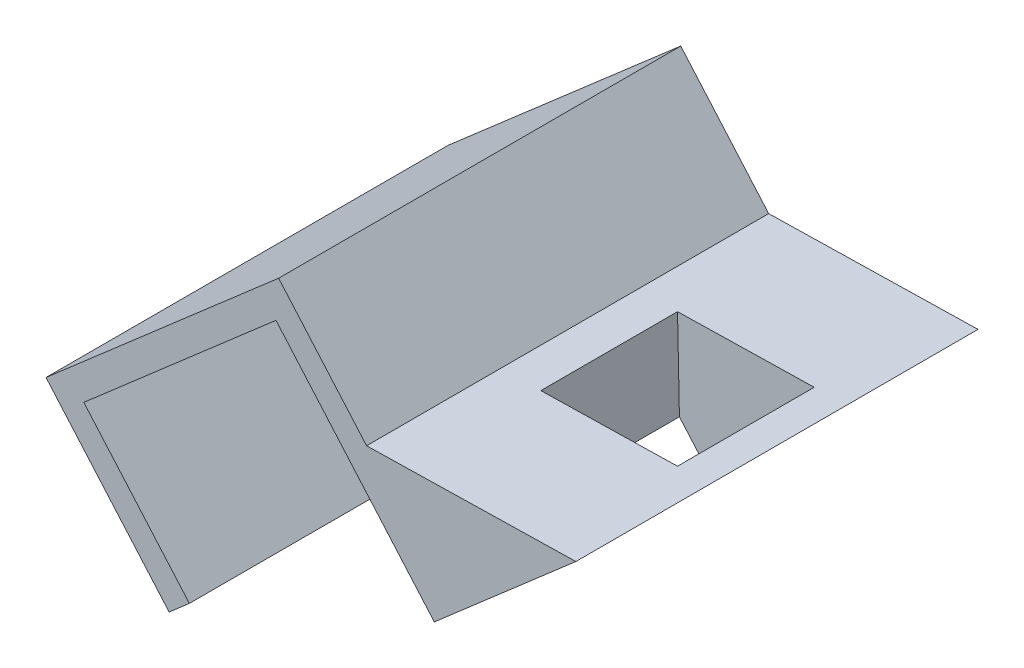
ISO-10303-21;
HEADER;
FILE_DESCRIPTION(('STEP AP214'),'2;1');
FILE_NAME('part.step','',(''),(''),'','','');
FILE_SCHEMA(('AUTOMOTIVE_DESIGN { 1 0 10303 214 1 1 1 1 }'));
ENDSEC;
DATA;
#1=APPLICATION_CONTEXT('core data for automotive mechanical design processes');
#2=APPLICATION_PROTOCOL_DEFINITION('international standard','automotive_design',2000,#1);
#3=PRODUCT_CONTEXT('',#1,'mechanical');
#4=PRODUCT('Part','Part','',(#3));
#5=PRODUCT_RELATED_PRODUCT_CATEGORY('part','',(#4));
#6=PRODUCT_DEFINITION_FORMATION('','',#4);
#7=PRODUCT_DEFINITION_CONTEXT('part definition',#1,'design');
#8=PRODUCT_DEFINITION('design','',#6,#7);
#9=PRODUCT_DEFINITION_SHAPE('','',#8);
#10=(LENGTH_UNIT() NAMED_UNIT(*) SI_UNIT(.MILLI.,.METRE.));
#11=(NAMED_UNIT(*) PLANE_ANGLE_UNIT() SI_UNIT($,.RADIAN.));
#12=(NAMED_UNIT(*) SI_UNIT($,.STERADIAN.) SOLID_ANGLE_UNIT());
#13=UNCERTAINTY_MEASURE_WITH_UNIT(LENGTH_MEASURE(1.E-05),#10,'distance_accuracy_value','');
#14=(GEOMETRIC_REPRESENTATION_CONTEXT(3) GLOBAL_UNCERTAINTY_ASSIGNED_CONTEXT((#13)) GLOBAL_UNIT_ASSIGNED_CONTEXT((#10,
#11,#12)) REPRESENTATION_CONTEXT('',''));
#15=CARTESIAN_POINT('',(0.,0.,0.));
#16=DIRECTION('',(0.,0.,1.));
#17=DIRECTION('',(1.,0.,0.));
#18=AXIS2_PLACEMENT_3D('',#15,#16,#17);
#19=CARTESIAN_POINT('',(-50.7944667552061,17.5002863270441,19.05));
#20=DIRECTION('',(0.754605522163505,0.656178714924787,0.));
#21=DIRECTION('',(-0.656178714924787,0.754605522163505,0.));
#22=AXIS2_PLACEMENT_3D('',#19,#20,#21);
#23=PLANE('',#22);
#24=DIRECTION('',(0.656178714924787,-0.754605522163505,0.));
#25=VECTOR('',#24,1.);
#26=CARTESIAN_POINT('',(-29.0582881771263,-7.49631903774771,-6.604));
#27=LINE('',#26,#25);
#28=CARTESIAN_POINT('',(-36.55577562074,1.12579152240805,-6.604));
#29=VERTEX_POINT('',#28);
#30=CARTESIAN_POINT('',(-34.1275273961166,-1.66669393590896,-6.60399999999999));
#31=VERTEX_POINT('',#30);
#32=EDGE_CURVE('E165',#29,#31,#27,.T.);
#33=ORIENTED_EDGE('',*,*,#32,.F.);
#34=DIRECTION('',(0.,0.,-1.));
#35=VECTOR('',#34,1.);
#36=CARTESIAN_POINT('',(-36.55577562074,1.12579152240804,6.35000000000001));
#37=LINE('',#36,#35);
#38=CARTESIAN_POINT('',(-36.55577562074,1.12579152240804,6.35));
#39=VERTEX_POINT('',#38);
#40=EDGE_CURVE('E174',#39,#29,#37,.T.);
#41=ORIENTED_EDGE('',*,*,#40,.F.);
#42=DIRECTION('',(-0.656178714924787,0.754605522163505,0.));
#43=VECTOR('',#42,1.);
#44=CARTESIAN_POINT('',(-29.0582881771263,-7.49631903774771,6.35));
#45=LINE('',#44,#43);
#46=CARTESIAN_POINT('',(-34.1275273961166,-1.66669393590896,6.35));
#47=VERTEX_POINT('',#46);
#48=EDGE_CURVE('E153',#47,#39,#45,.T.);
#49=ORIENTED_EDGE('',*,*,#48,.F.);
#50=DIRECTION('',(0.,0.,-1.));
#51=VECTOR('',#50,1.);
#52=CARTESIAN_POINT('',(-34.1275273961166,-1.66669393590896,19.05));
#53=LINE('',#52,#51);
#54=CARTESIAN_POINT('',(-34.1275273961166,-1.66669393590896,19.05));
#55=VERTEX_POINT('',#54);
#56=EDGE_CURVE('E169',#55,#47,#53,.T.);
#57=ORIENTED_EDGE('',*,*,#56,.F.);
#58=DIRECTION('',(0.656178714924787,-0.754605522163505,0.));
#59=VECTOR('',#58,1.);
#60=CARTESIAN_POINT('',(-50.7944667552061,17.5002863270441,19.05));
#61=LINE('',#60,#59);
#62=CARTESIAN_POINT('',(-49.1277728192972,15.5835883007488,19.05));
#63=VERTEX_POINT('',#62);
#64=EDGE_CURVE('E233',#63,#55,#61,.T.);
#65=ORIENTED_EDGE('',*,*,#64,.F.);
#66=DIRECTION('',(0.,0.,-1.));
#67=VECTOR('',#66,1.);
#68=CARTESIAN_POINT('',(-49.1277728192972,15.5835883007488,19.05));
#69=LINE('',#68,#67);
#70=CARTESIAN_POINT('',(-49.1277728192972,15.5835883007488,-19.05));
#71=VERTEX_POINT('',#70);
#72=EDGE_CURVE('E260',#63,#71,#69,.T.);
#73=ORIENTED_EDGE('',*,*,#72,.T.);
#74=DIRECTION('',(0.656178714924787,-0.754605522163505,0.));
#75=VECTOR('',#74,1.);
#76=CARTESIAN_POINT('',(-50.7944667552061,17.5002863270441,-19.05));
#77=LINE('',#76,#75);
#78=CARTESIAN_POINT('',(-34.1275273961166,-1.66669393590896,-19.05));
#79=VERTEX_POINT('',#78);
#80=EDGE_CURVE('E198',#71,#79,#77,.T.);
#81=ORIENTED_EDGE('',*,*,#80,.T.);
#82=EDGE_CURVE('E182',#31,#79,#53,.T.);
#83=ORIENTED_EDGE('',*,*,#82,.F.);
#84=EDGE_LOOP('',(#33,#41,#49,#57,#65,#73,#81,#83));
#85=FACE_BOUND('',#84,.T.);
#86=ADVANCED_FACE('F44',(#85),#23,.F.);
#87=CARTESIAN_POINT('',(-32.2108293698213,0.,19.05));
#88=DIRECTION('',(0.656178714924787,-0.754605522163504,0.));
#89=DIRECTION('',(0.754605522163504,0.656178714924787,0.));
#90=AXIS2_PLACEMENT_3D('',#87,#88,#89);
#91=PLANE('',#90);
#92=DIRECTION('',(0.,0.,-1.));
#93=VECTOR('',#92,1.);
#94=CARTESIAN_POINT('',(-23.7301919934995,7.37446728375806,6.35));
#95=LINE('',#94,#93);
#96=CARTESIAN_POINT('',(-23.7301919934995,7.37446728375805,6.35));
#97=VERTEX_POINT('',#96);
#98=CARTESIAN_POINT('',(-23.7301919934995,7.37446728375806,-6.604));
#99=VERTEX_POINT('',#98);
#100=EDGE_CURVE('E220',#97,#99,#95,.T.);
#101=ORIENTED_EDGE('',*,*,#100,.T.);
#102=DIRECTION('',(-0.754605522163504,-0.656178714924787,0.));
#103=VECTOR('',#102,1.);
#104=CARTESIAN_POINT('',(-41.3126195295797,-7.91460013892038,-6.604));
#105=LINE('',#104,#103);
#106=EDGE_CURVE('E58',#99,#31,#105,.T.);
#107=ORIENTED_EDGE('',*,*,#106,.T.);
#108=ORIENTED_EDGE('',*,*,#82,.T.);
#109=DIRECTION('',(-0.754605522163504,-0.656178714924787,0.));
#110=VECTOR('',#109,1.);
#111=CARTESIAN_POINT('',(-32.2108293698213,0.,-19.05));
#112=LINE('',#111,#110);
#113=CARTESIAN_POINT('',(-20.7106412120494,10.0001636154538,-19.05));
#114=VERTEX_POINT('',#113);
#115=EDGE_CURVE('E192',#114,#79,#112,.T.);
#116=ORIENTED_EDGE('',*,*,#115,.F.);
#117=DIRECTION('',(0.,0.,1.));
#118=VECTOR('',#117,1.);
#119=CARTESIAN_POINT('',(-20.7106412120495,10.0001636154538,19.05));
#120=LINE('',#119,#118);
#121=CARTESIAN_POINT('',(-20.7106412120495,10.0001636154538,19.05));
#122=VERTEX_POINT('',#121);
#123=EDGE_CURVE('E197',#114,#122,#120,.T.);
#124=ORIENTED_EDGE('',*,*,#123,.T.);
#125=DIRECTION('',(-0.754605522163504,-0.656178714924787,0.));
#126=VECTOR('',#125,1.);
#127=CARTESIAN_POINT('',(-32.2108293698213,0.,19.05));
#128=LINE('',#127,#126);
#129=EDGE_CURVE('E180',#122,#55,#128,.T.);
#130=ORIENTED_EDGE('',*,*,#129,.T.);
#131=ORIENTED_EDGE('',*,*,#56,.T.);
#132=DIRECTION('',(0.754605522163504,0.656178714924787,0.));
#133=VECTOR('',#132,1.);
#134=CARTESIAN_POINT('',(-41.3126195295797,-7.91460013892038,6.35));
#135=LINE('',#134,#133);
#136=EDGE_CURVE('E149',#47,#97,#135,.T.);
#137=ORIENTED_EDGE('',*,*,#136,.T.);
#138=EDGE_LOOP('',(#101,#107,#108,#116,#124,#130,#131,#137));
#139=FACE_BOUND('',#138,.T.);
#140=ADVANCED_FACE('F172',(#139),#91,.T.);
#141=CARTESIAN_POINT('',(-20.7106412120495,10.0001636154538,19.05));
#142=DIRECTION('',(0.0210037688343365,-0.999779396514428,0.));
#143=DIRECTION('',(0.999779396514428,0.0210037688343366,0.));
#144=AXIS2_PLACEMENT_3D('',#141,#142,#143);
#145=PLANE('',#144);
#146=DIRECTION('',(0.,0.,-1.));
#147=VECTOR('',#146,1.);
#148=CARTESIAN_POINT('',(-40.5442990493661,9.58349013147651,19.05));
#149=LINE('',#148,#147);
#150=CARTESIAN_POINT('',(-40.5442990493661,9.58349013147652,19.05));
#151=VERTEX_POINT('',#150);
#152=CARTESIAN_POINT('',(-40.5442990493661,9.58349013147651,-19.05));
#153=VERTEX_POINT('',#152);
#154=EDGE_CURVE('E200',#151,#153,#149,.T.);
#155=ORIENTED_EDGE('',*,*,#154,.F.);
#156=DIRECTION('',(-0.999779396514428,-0.0210037688343365,0.));
#157=VECTOR('',#156,1.);
#158=CARTESIAN_POINT('',(-20.7106412120495,10.0001636154538,19.05));
#159=LINE('',#158,#157);
#160=EDGE_CURVE('E199',#122,#151,#159,.T.);
#161=ORIENTED_EDGE('',*,*,#160,.F.);
#162=ORIENTED_EDGE('',*,*,#123,.F.);
#163=DIRECTION('',(-0.999779396514428,-0.0210037688343366,0.));
#164=VECTOR('',#163,1.);
#165=CARTESIAN_POINT('',(-0.219131460457942,10.4306575177981,-19.05));
#166=LINE('',#165,#164);
#167=EDGE_CURVE('E210',#114,#153,#166,.T.);
#168=ORIENTED_EDGE('',*,*,#167,.T.);
#169=EDGE_LOOP('',(#155,#161,#162,#168));
#170=FACE_BOUND('',#169,.T.);
#171=DIRECTION('',(0.,0.,1.));
#172=VECTOR('',#171,1.);
#173=CARTESIAN_POINT('',(-36.7351395486461,9.66351449073534,19.05));
#174=LINE('',#173,#172);
#175=CARTESIAN_POINT('',(-36.7351395486461,9.66351449073534,-6.604));
#176=VERTEX_POINT('',#175);
#177=CARTESIAN_POINT('',(-36.7351395486461,9.66351449073534,6.35));
#178=VERTEX_POINT('',#177);
#179=EDGE_CURVE('E11',#176,#178,#174,.T.);
#180=ORIENTED_EDGE('',*,*,#179,.F.);
#181=DIRECTION('',(-0.999779396514428,-0.0210037688343366,0.));
#182=VECTOR('',#181,1.);
#183=CARTESIAN_POINT('',(-20.7106412120495,10.0001636154538,-6.604));
#184=LINE('',#183,#182);
#185=CARTESIAN_POINT('',(-23.7839972461982,9.93559731221534,-6.604));
#186=VERTEX_POINT('',#185);
#187=EDGE_CURVE('E178',#186,#176,#184,.T.);
#188=ORIENTED_EDGE('',*,*,#187,.F.);
#189=DIRECTION('',(0.,0.,-1.));
#190=VECTOR('',#189,1.);
#191=CARTESIAN_POINT('',(-23.7839972461982,9.93559731221534,19.05));
#192=LINE('',#191,#190);
#193=CARTESIAN_POINT('',(-23.7839972461982,9.93559731221534,6.35));
#194=VERTEX_POINT('',#193);
#195=EDGE_CURVE('E184',#194,#186,#192,.T.);
#196=ORIENTED_EDGE('',*,*,#195,.F.);
#197=DIRECTION('',(0.999779396514428,0.0210037688343366,0.));
#198=VECTOR('',#197,1.);
#199=CARTESIAN_POINT('',(-20.7106412120495,10.0001636154538,6.35));
#200=LINE('',#199,#198);
#201=EDGE_CURVE('E52',#178,#194,#200,.T.);
#202=ORIENTED_EDGE('',*,*,#201,.F.);
#203=EDGE_LOOP('',(#180,#188,#196,#202));
#204=FACE_BOUND('',#203,.T.);
#205=ADVANCED_FACE('F218',(#170,#204),#145,.F.);
#206=CARTESIAN_POINT('',(-48.8777687289108,19.166980262953,19.05));
#207=DIRECTION('',(0.754605522163505,0.656178714924787,0.));
#208=DIRECTION('',(-0.656178714924787,0.754605522163505,0.));
#209=AXIS2_PLACEMENT_3D('',#206,#207,#208);
#210=PLANE('',#209);
#211=DIRECTION('',(0.656178714924787,-0.754605522163505,0.));
#212=VECTOR('',#211,1.);
#213=CARTESIAN_POINT('',(-48.8777687289108,19.166980262953,19.05));
#214=LINE('',#213,#212);
#215=CARTESIAN_POINT('',(-48.8777687289108,19.166980262953,19.05));
#216=VERTEX_POINT('',#215);
#217=EDGE_CURVE('E238',#216,#151,#214,.T.);
#218=ORIENTED_EDGE('',*,*,#217,.T.);
#219=ORIENTED_EDGE('',*,*,#154,.T.);
#220=DIRECTION('',(0.656178714924787,-0.754605522163505,0.));
#221=VECTOR('',#220,1.);
#222=CARTESIAN_POINT('',(-48.8777687289108,19.166980262953,-19.05));
#223=LINE('',#222,#221);
#224=CARTESIAN_POINT('',(-48.8777687289108,19.166980262953,-19.05));
#225=VERTEX_POINT('',#224);
#226=EDGE_CURVE('E193',#225,#153,#223,.T.);
#227=ORIENTED_EDGE('',*,*,#226,.F.);
#228=DIRECTION('',(0.,0.,-1.));
#229=VECTOR('',#228,1.);
#230=CARTESIAN_POINT('',(-48.8777687289108,19.166980262953,19.05));
#231=LINE('',#230,#229);
#232=EDGE_CURVE('E186',#216,#225,#231,.T.);
#233=ORIENTED_EDGE('',*,*,#232,.F.);
#234=EDGE_LOOP('',(#218,#219,#227,#233));
#235=FACE_BOUND('',#234,.T.);
#236=ADVANCED_FACE('F288',(#235),#210,.T.);
#237=CARTESIAN_POINT('',(-70.9197960313068,0.,19.05));
#238=DIRECTION('',(-0.656178714924787,0.754605522163505,0.));
#239=DIRECTION('',(-0.754605522163505,-0.656178714924787,0.));
#240=AXIS2_PLACEMENT_3D('',#237,#238,#239);
#241=PLANE('',#240);
#242=DIRECTION('',(0.754605522163505,0.656178714924787,0.));
#243=VECTOR('',#242,1.);
#244=CARTESIAN_POINT('',(-70.9197960313068,0.,-19.05));
#245=LINE('',#244,#243);
#246=CARTESIAN_POINT('',(-70.9197960313068,0.,-19.05));
#247=VERTEX_POINT('',#246);
#248=EDGE_CURVE('E206',#247,#225,#245,.T.);
#249=ORIENTED_EDGE('',*,*,#248,.F.);
#250=DIRECTION('',(0.,0.,-1.));
#251=VECTOR('',#250,1.);
#252=CARTESIAN_POINT('',(-70.9197960313068,0.,19.05));
#253=LINE('',#252,#251);
#254=CARTESIAN_POINT('',(-70.9197960313068,0.,19.05));
#255=VERTEX_POINT('',#254);
#256=EDGE_CURVE('E278',#255,#247,#253,.T.);
#257=ORIENTED_EDGE('',*,*,#256,.F.);
#258=DIRECTION('',(0.754605522163505,0.656178714924787,0.));
#259=VECTOR('',#258,1.);
#260=CARTESIAN_POINT('',(-70.9197960313068,0.,19.05));
#261=LINE('',#260,#259);
#262=EDGE_CURVE('E243',#255,#216,#261,.T.);
#263=ORIENTED_EDGE('',*,*,#262,.T.);
#264=ORIENTED_EDGE('',*,*,#232,.T.);
#265=EDGE_LOOP('',(#249,#257,#263,#264));
#266=FACE_BOUND('',#265,.T.);
#267=ADVANCED_FACE('F287',(#266),#241,.T.);
#268=CARTESIAN_POINT('',(-70.9197960313068,0.,19.05));
#269=DIRECTION('',(-0.754605522163505,-0.656178714924787,0.));
#270=DIRECTION('',(0.656178714924787,-0.754605522163505,0.));
#271=AXIS2_PLACEMENT_3D('',#268,#269,#270);
#272=PLANE('',#271);
#273=DIRECTION('',(-0.656178714924787,0.754605522163505,0.));
#274=VECTOR('',#273,1.);
#275=CARTESIAN_POINT('',(-70.9197960313068,0.,-19.05));
#276=LINE('',#275,#274);
#277=CARTESIAN_POINT('',(-59.2529384799441,-13.4168861840671,-19.05));
#278=VERTEX_POINT('',#277);
#279=EDGE_CURVE('E263',#278,#247,#276,.T.);
#280=ORIENTED_EDGE('',*,*,#279,.F.);
#281=DIRECTION('',(0.,0.,-1.));
#282=VECTOR('',#281,1.);
#283=CARTESIAN_POINT('',(-59.2529384799441,-13.4168861840671,19.05));
#284=LINE('',#283,#282);
#285=CARTESIAN_POINT('',(-59.2529384799441,-13.4168861840671,19.05));
#286=VERTEX_POINT('',#285);
#287=EDGE_CURVE('E276',#286,#278,#284,.T.);
#288=ORIENTED_EDGE('',*,*,#287,.F.);
#289=DIRECTION('',(-0.656178714924787,0.754605522163505,0.));
#290=VECTOR('',#289,1.);
#291=CARTESIAN_POINT('',(-70.9197960313068,0.,19.05));
#292=LINE('',#291,#290);
#293=EDGE_CURVE('E249',#286,#255,#292,.T.);
#294=ORIENTED_EDGE('',*,*,#293,.T.);
#295=ORIENTED_EDGE('',*,*,#256,.T.);
#296=EDGE_LOOP('',(#280,#288,#294,#295));
#297=FACE_BOUND('',#296,.T.);
#298=ADVANCED_FACE('F299',(#297),#272,.T.);
#299=CARTESIAN_POINT('',(-57.3362404536488,-11.7501922481582,19.05));
#300=DIRECTION('',(0.656178714924783,-0.754605522163508,0.));
#301=DIRECTION('',(0.754605522163508,0.656178714924783,0.));
#302=AXIS2_PLACEMENT_3D('',#299,#300,#301);
#303=PLANE('',#302);
#304=DIRECTION('',(-0.754605522163508,-0.656178714924783,0.));
#305=VECTOR('',#304,1.);
#306=CARTESIAN_POINT('',(-57.3362404536488,-11.7501922481582,-19.05));
#307=LINE('',#306,#305);
#308=CARTESIAN_POINT('',(-57.3362404536488,-11.7501922481582,-19.05));
#309=VERTEX_POINT('',#308);
#310=EDGE_CURVE('E266',#309,#278,#307,.T.);
#311=ORIENTED_EDGE('',*,*,#310,.F.);
#312=DIRECTION('',(0.,0.,-1.));
#313=VECTOR('',#312,1.);
#314=CARTESIAN_POINT('',(-57.3362404536488,-11.7501922481582,19.05));
#315=LINE('',#314,#313);
#316=CARTESIAN_POINT('',(-57.3362404536488,-11.7501922481582,19.05));
#317=VERTEX_POINT('',#316);
#318=EDGE_CURVE('E280',#317,#309,#315,.T.);
#319=ORIENTED_EDGE('',*,*,#318,.F.);
#320=DIRECTION('',(-0.754605522163508,-0.656178714924783,0.));
#321=VECTOR('',#320,1.);
#322=CARTESIAN_POINT('',(-57.3362404536488,-11.7501922481582,19.05));
#323=LINE('',#322,#321);
#324=EDGE_CURVE('E248',#317,#286,#323,.T.);
#325=ORIENTED_EDGE('',*,*,#324,.T.);
#326=ORIENTED_EDGE('',*,*,#287,.T.);
#327=EDGE_LOOP('',(#311,#319,#325,#326));
#328=FACE_BOUND('',#327,.T.);
#329=ADVANCED_FACE('F304',(#328),#303,.T.);
#330=CARTESIAN_POINT('',(-69.0030980050115,1.66669393590896,19.05));
#331=DIRECTION('',(-0.754605522163505,-0.656178714924787,0.));
#332=DIRECTION('',(0.656178714924787,-0.754605522163505,0.));
#333=AXIS2_PLACEMENT_3D('',#330,#331,#332);
#334=PLANE('',#333);
#335=DIRECTION('',(-0.656178714924787,0.754605522163505,0.));
#336=VECTOR('',#335,1.);
#337=CARTESIAN_POINT('',(-69.0030980050115,1.66669393590896,-19.05));
#338=LINE('',#337,#336);
#339=CARTESIAN_POINT('',(-67.3364040691025,-0.25000409038634,-19.05));
#340=VERTEX_POINT('',#339);
#341=EDGE_CURVE('E267',#309,#340,#338,.T.);
#342=ORIENTED_EDGE('',*,*,#341,.T.);
#343=DIRECTION('',(0.,0.,-1.));
#344=VECTOR('',#343,1.);
#345=CARTESIAN_POINT('',(-67.3364040691025,-0.25000409038634,19.05));
#346=LINE('',#345,#344);
#347=CARTESIAN_POINT('',(-67.3364040691025,-0.25000409038634,19.05));
#348=VERTEX_POINT('',#347);
#349=EDGE_CURVE('E273',#348,#340,#346,.T.);
#350=ORIENTED_EDGE('',*,*,#349,.F.);
#351=DIRECTION('',(-0.656178714924787,0.754605522163505,0.));
#352=VECTOR('',#351,1.);
#353=CARTESIAN_POINT('',(-69.0030980050115,1.66669393590896,19.05));
#354=LINE('',#353,#352);
#355=EDGE_CURVE('E251',#317,#348,#354,.T.);
#356=ORIENTED_EDGE('',*,*,#355,.F.);
#357=ORIENTED_EDGE('',*,*,#318,.T.);
#358=EDGE_LOOP('',(#342,#350,#356,#357));
#359=FACE_BOUND('',#358,.T.);
#360=ADVANCED_FACE('F308',(#359),#334,.F.);
#361=CARTESIAN_POINT('',(-69.2531020953978,-1.9166980262953,19.05));
#362=DIRECTION('',(-0.656178714924787,0.754605522163504,0.));
#363=DIRECTION('',(-0.754605522163505,-0.656178714924787,0.));
#364=AXIS2_PLACEMENT_3D('',#361,#362,#363);
#365=PLANE('',#364);
#366=DIRECTION('',(0.754605522163504,0.656178714924787,0.));
#367=VECTOR('',#366,1.);
#368=CARTESIAN_POINT('',(-69.2531020953978,-1.9166980262953,-19.05));
#369=LINE('',#368,#367);
#370=EDGE_CURVE('E236',#340,#71,#369,.T.);
#371=ORIENTED_EDGE('',*,*,#370,.T.);
#372=ORIENTED_EDGE('',*,*,#72,.F.);
#373=DIRECTION('',(0.754605522163504,0.656178714924787,0.));
#374=VECTOR('',#373,1.);
#375=CARTESIAN_POINT('',(-69.2531020953978,-1.9166980262953,19.05));
#376=LINE('',#375,#374);
#377=EDGE_CURVE('E254',#348,#63,#376,.T.);
#378=ORIENTED_EDGE('',*,*,#377,.F.);
#379=ORIENTED_EDGE('',*,*,#349,.T.);
#380=EDGE_LOOP('',(#371,#372,#378,#379));
#381=FACE_BOUND('',#380,.T.);
#382=ADVANCED_FACE('F309',(#381),#365,.F.);
#383=CARTESIAN_POINT('',(0.,0.,19.05));
#384=DIRECTION('',(0.,0.,-1.));
#385=DIRECTION('',(-1.,0.,0.));
#386=AXIS2_PLACEMENT_3D('',#383,#384,#385);
#387=PLANE('',#386);
#388=ORIENTED_EDGE('',*,*,#129,.F.);
#389=ORIENTED_EDGE('',*,*,#160,.T.);
#390=ORIENTED_EDGE('',*,*,#217,.F.);
#391=ORIENTED_EDGE('',*,*,#262,.F.);
#392=ORIENTED_EDGE('',*,*,#293,.F.);
#393=ORIENTED_EDGE('',*,*,#324,.F.);
#394=ORIENTED_EDGE('',*,*,#355,.T.);
#395=ORIENTED_EDGE('',*,*,#377,.T.);
#396=ORIENTED_EDGE('',*,*,#64,.T.);
#397=EDGE_LOOP('',(#388,#389,#390,#391,#392,#393,#394,#395,#396));
#398=FACE_BOUND('',#397,.T.);
#399=ADVANCED_FACE('F302',(#398),#387,.F.);
#400=CARTESIAN_POINT('',(0.,0.,-19.05));
#401=DIRECTION('',(0.,0.,-1.));
#402=DIRECTION('',(-1.,0.,0.));
#403=AXIS2_PLACEMENT_3D('',#400,#401,#402);
#404=PLANE('',#403);
#405=ORIENTED_EDGE('',*,*,#167,.F.);
#406=ORIENTED_EDGE('',*,*,#115,.T.);
#407=ORIENTED_EDGE('',*,*,#80,.F.);
#408=ORIENTED_EDGE('',*,*,#370,.F.);
#409=ORIENTED_EDGE('',*,*,#341,.F.);
#410=ORIENTED_EDGE('',*,*,#310,.T.);
#411=ORIENTED_EDGE('',*,*,#279,.T.);
#412=ORIENTED_EDGE('',*,*,#248,.T.);
#413=ORIENTED_EDGE('',*,*,#226,.T.);
#414=EDGE_LOOP('',(#405,#406,#407,#408,#409,#410,#411,#412,#413));
#415=FACE_BOUND('',#414,.T.);
#416=ADVANCED_FACE('F291',(#415),#404,.T.);
#417=CARTESIAN_POINT('',(-36.9497849576176,19.8806359577784,6.35));
#418=DIRECTION('',(0.999779396514428,0.0210037688343366,0.));
#419=DIRECTION('',(-0.0210037688343366,0.999779396514428,0.));
#420=AXIS2_PLACEMENT_3D('',#417,#418,#419);
#421=PLANE('',#420);
#422=ORIENTED_EDGE('',*,*,#179,.T.);
#423=DIRECTION('',(0.0210037688343366,-0.999779396514428,0.));
#424=VECTOR('',#423,1.);
#425=CARTESIAN_POINT('',(-36.9497849576176,19.8806359577784,6.35));
#426=LINE('',#425,#424);
#427=EDGE_CURVE('E208',#178,#39,#426,.T.);
#428=ORIENTED_EDGE('',*,*,#427,.T.);
#429=ORIENTED_EDGE('',*,*,#40,.T.);
#430=DIRECTION('',(0.0210037688343366,-0.999779396514428,0.));
#431=VECTOR('',#430,1.);
#432=CARTESIAN_POINT('',(-36.9497849576176,19.8806359577784,-6.604));
#433=LINE('',#432,#431);
#434=EDGE_CURVE('E175',#176,#29,#433,.T.);
#435=ORIENTED_EDGE('',*,*,#434,.F.);
#436=EDGE_LOOP('',(#422,#428,#429,#435));
#437=FACE_BOUND('',#436,.T.);
#438=ADVANCED_FACE('F224',(#437),#421,.T.);
#439=CARTESIAN_POINT('',(-36.9497849576176,19.8806359577784,6.35));
#440=DIRECTION('',(0.,0.,-1.));
#441=DIRECTION('',(-1.,0.,0.));
#442=AXIS2_PLACEMENT_3D('',#439,#440,#441);
#443=PLANE('',#442);
#444=ORIENTED_EDGE('',*,*,#201,.T.);
#445=DIRECTION('',(0.0210037688343366,-0.999779396514428,0.));
#446=VECTOR('',#445,1.);
#447=CARTESIAN_POINT('',(-23.9986426551697,20.1527187792584,6.35));
#448=LINE('',#447,#446);
#449=EDGE_CURVE('E156',#194,#97,#448,.T.);
#450=ORIENTED_EDGE('',*,*,#449,.T.);
#451=ORIENTED_EDGE('',*,*,#136,.F.);
#452=ORIENTED_EDGE('',*,*,#48,.T.);
#453=ORIENTED_EDGE('',*,*,#427,.F.);
#454=EDGE_LOOP('',(#444,#450,#451,#452,#453));
#455=FACE_BOUND('',#454,.T.);
#456=ADVANCED_FACE('F151',(#455),#443,.T.);
#457=CARTESIAN_POINT('',(-23.9986426551697,20.1527187792584,6.35));
#458=DIRECTION('',(-0.999779396514428,-0.0210037688343366,0.));
#459=DIRECTION('',(0.0210037688343366,-0.999779396514428,0.));
#460=AXIS2_PLACEMENT_3D('',#457,#458,#459);
#461=PLANE('',#460);
#462=ORIENTED_EDGE('',*,*,#195,.T.);
#463=DIRECTION('',(0.0210037688343366,-0.999779396514428,0.));
#464=VECTOR('',#463,1.);
#465=CARTESIAN_POINT('',(-23.9986426551697,20.1527187792584,-6.604));
#466=LINE('',#465,#464);
#467=EDGE_CURVE('E63',#186,#99,#466,.T.);
#468=ORIENTED_EDGE('',*,*,#467,.T.);
#469=ORIENTED_EDGE('',*,*,#100,.F.);
#470=ORIENTED_EDGE('',*,*,#449,.F.);
#471=EDGE_LOOP('',(#462,#468,#469,#470));
#472=FACE_BOUND('',#471,.T.);
#473=ADVANCED_FACE('F214',(#472),#461,.T.);
#474=CARTESIAN_POINT('',(-36.9497849576176,19.8806359577784,-6.604));
#475=DIRECTION('',(0.,0.,1.));
#476=DIRECTION('',(1.,0.,0.));
#477=AXIS2_PLACEMENT_3D('',#474,#475,#476);
#478=PLANE('',#477);
#479=ORIENTED_EDGE('',*,*,#187,.T.);
#480=ORIENTED_EDGE('',*,*,#434,.T.);
#481=ORIENTED_EDGE('',*,*,#32,.T.);
#482=ORIENTED_EDGE('',*,*,#106,.F.);
#483=ORIENTED_EDGE('',*,*,#467,.F.);
#484=EDGE_LOOP('',(#479,#480,#481,#482,#483));
#485=FACE_BOUND('',#484,.T.);
#486=ADVANCED_FACE('F222',(#485),#478,.T.);
#487=CLOSED_SHELL('',(#86,#140,#205,#236,#267,#298,#329,#360,#382,#399,#416,#438,#456,#473,#486));
#488=MANIFOLD_SOLID_BREP('B2',#487);
#489=ADVANCED_BREP_SHAPE_REPRESENTATION('',(#18,#488),#14);
#490=SHAPE_DEFINITION_REPRESENTATION(#9,#489);
ENDSEC;
END-ISO-10303-21;
